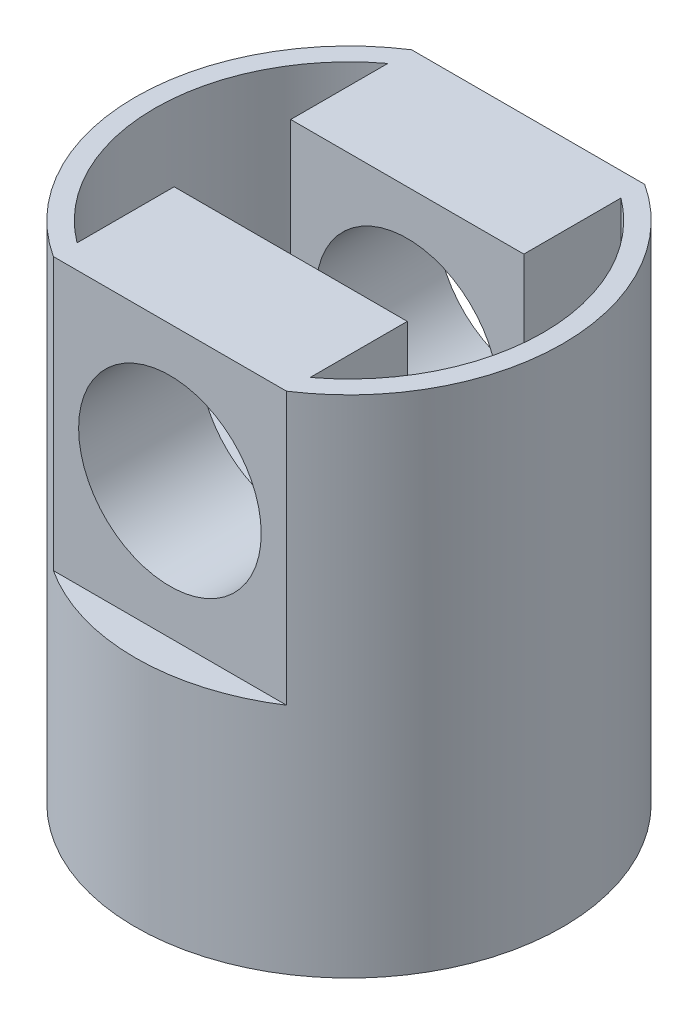
ISO-10303-21;
HEADER;
FILE_DESCRIPTION(('STEP AP214'),'2;1');
FILE_NAME('part.step','',(''),(''),'','','');
FILE_SCHEMA(('AUTOMOTIVE_DESIGN { 1 0 10303 214 1 1 1 1 }'));
ENDSEC;
DATA;
#1=APPLICATION_CONTEXT('core data for automotive mechanical design processes');
#2=APPLICATION_PROTOCOL_DEFINITION('international standard','automotive_design',2000,#1);
#3=PRODUCT_CONTEXT('',#1,'mechanical');
#4=PRODUCT('Part','Part','',(#3));
#5=PRODUCT_RELATED_PRODUCT_CATEGORY('part','',(#4));
#6=PRODUCT_DEFINITION_FORMATION('','',#4);
#7=PRODUCT_DEFINITION_CONTEXT('part definition',#1,'design');
#8=PRODUCT_DEFINITION('design','',#6,#7);
#9=PRODUCT_DEFINITION_SHAPE('','',#8);
#10=(LENGTH_UNIT() NAMED_UNIT(*) SI_UNIT(.MILLI.,.METRE.));
#11=(NAMED_UNIT(*) PLANE_ANGLE_UNIT() SI_UNIT($,.RADIAN.));
#12=(NAMED_UNIT(*) SI_UNIT($,.STERADIAN.) SOLID_ANGLE_UNIT());
#13=UNCERTAINTY_MEASURE_WITH_UNIT(LENGTH_MEASURE(1.E-05),#10,'distance_accuracy_value','');
#14=(GEOMETRIC_REPRESENTATION_CONTEXT(3) GLOBAL_UNCERTAINTY_ASSIGNED_CONTEXT((#13)) GLOBAL_UNIT_ASSIGNED_CONTEXT((#10,
#11,#12)) REPRESENTATION_CONTEXT('',''));
#15=CARTESIAN_POINT('',(0.,0.,0.));
#16=DIRECTION('',(0.,0.,1.));
#17=DIRECTION('',(1.,0.,0.));
#18=AXIS2_PLACEMENT_3D('',#15,#16,#17);
#19=CARTESIAN_POINT('',(-10.,2.,0.));
#20=DIRECTION('',(0.,-1.,0.));
#21=DIRECTION('',(0.,0.,-1.));
#22=AXIS2_PLACEMENT_3D('',#19,#20,#21);
#23=PLANE('',#22);
#24=CARTESIAN_POINT('',(0.,2.,0.));
#25=DIRECTION('',(0.,-1.,0.));
#26=DIRECTION('',(0.,0.,-1.));
#27=AXIS2_PLACEMENT_3D('',#24,#25,#26);
#28=CIRCLE('',#27,11.);
#29=CARTESIAN_POINT('',(6.,2.,9.21954445729288));
#30=VERTEX_POINT('',#29);
#31=CARTESIAN_POINT('',(-6.,1.99999999999999,9.21954445729289));
#32=VERTEX_POINT('',#31);
#33=EDGE_CURVE('E48',#30,#32,#28,.T.);
#34=ORIENTED_EDGE('',*,*,#33,.F.);
#35=DIRECTION('',(1.,0.,0.));
#36=VECTOR('',#35,1.);
#37=CARTESIAN_POINT('',(-6.,2.,9.21954445729289));
#38=LINE('',#37,#36);
#39=EDGE_CURVE('E55',#32,#30,#38,.T.);
#40=ORIENTED_EDGE('',*,*,#39,.F.);
#41=EDGE_LOOP('',(#34,#40));
#42=FACE_BOUND('',#41,.T.);
#43=ADVANCED_FACE('F39',(#42),#23,.F.);
#44=CARTESIAN_POINT('',(0.,2.,0.));
#45=DIRECTION('',(0.,-1.,0.));
#46=DIRECTION('',(0.,0.,-1.));
#47=AXIS2_PLACEMENT_3D('',#44,#45,#46);
#48=CIRCLE('',#47,11.);
#49=CARTESIAN_POINT('',(-6.,2.,-9.21954445729289));
#50=VERTEX_POINT('',#49);
#51=CARTESIAN_POINT('',(6.,2.,-9.21954445729289));
#52=VERTEX_POINT('',#51);
#53=EDGE_CURVE('E273',#50,#52,#48,.T.);
#54=ORIENTED_EDGE('',*,*,#53,.F.);
#55=DIRECTION('',(-1.,0.,0.));
#56=VECTOR('',#55,1.);
#57=CARTESIAN_POINT('',(-6.,2.,-9.21954445729289));
#58=LINE('',#57,#56);
#59=EDGE_CURVE('E208',#52,#50,#58,.T.);
#60=ORIENTED_EDGE('',*,*,#59,.F.);
#61=EDGE_LOOP('',(#54,#60));
#62=FACE_BOUND('',#61,.T.);
#63=ADVANCED_FACE('F289',(#62),#23,.F.);
#64=CARTESIAN_POINT('',(0.,0.,0.));
#65=DIRECTION('',(0.,-1.,0.));
#66=DIRECTION('',(0.,0.,-1.));
#67=AXIS2_PLACEMENT_3D('',#64,#65,#66);
#68=CYLINDRICAL_SURFACE('',#67,10.);
#69=CARTESIAN_POINT('',(0.,16.,0.));
#70=DIRECTION('',(0.,-1.,0.));
#71=DIRECTION('',(0.,0.,-1.));
#72=AXIS2_PLACEMENT_3D('',#69,#70,#71);
#73=CIRCLE('',#72,10.);
#74=CARTESIAN_POINT('',(-6.,16.,7.99999999999999));
#75=VERTEX_POINT('',#74);
#76=CARTESIAN_POINT('',(-6.,16.,-7.99999999999999));
#77=VERTEX_POINT('',#76);
#78=EDGE_CURVE('E258',#75,#77,#73,.T.);
#79=ORIENTED_EDGE('',*,*,#78,.F.);
#80=DIRECTION('',(0.,-1.,0.));
#81=VECTOR('',#80,1.);
#82=CARTESIAN_POINT('',(-6.,0.,8.));
#83=LINE('',#82,#81);
#84=CARTESIAN_POINT('',(-6.,2.,8.));
#85=VERTEX_POINT('',#84);
#86=EDGE_CURVE('E224',#75,#85,#83,.T.);
#87=ORIENTED_EDGE('',*,*,#86,.T.);
#88=CARTESIAN_POINT('',(0.,2.,0.));
#89=DIRECTION('',(0.,-1.,0.));
#90=DIRECTION('',(0.,0.,-1.));
#91=AXIS2_PLACEMENT_3D('',#88,#89,#90);
#92=CIRCLE('',#91,10.);
#93=CARTESIAN_POINT('',(-6.,2.,-7.99999999999999));
#94=VERTEX_POINT('',#93);
#95=EDGE_CURVE('E178',#85,#94,#92,.T.);
#96=ORIENTED_EDGE('',*,*,#95,.T.);
#97=DIRECTION('',(0.,-1.,0.));
#98=VECTOR('',#97,1.);
#99=CARTESIAN_POINT('',(-6.,0.,-8.));
#100=LINE('',#99,#98);
#101=EDGE_CURVE('E218',#94,#77,#100,.F.);
#102=ORIENTED_EDGE('',*,*,#101,.T.);
#103=EDGE_LOOP('',(#79,#87,#96,#102));
#104=FACE_BOUND('',#103,.T.);
#105=ADVANCED_FACE('F294',(#104),#68,.F.);
#106=CARTESIAN_POINT('',(-10.,0.,0.));
#107=DIRECTION('',(0.,1.,0.));
#108=DIRECTION('',(0.,0.,1.));
#109=AXIS2_PLACEMENT_3D('',#106,#107,#108);
#110=PLANE('',#109);
#111=DIRECTION('',(1.,0.,0.));
#112=VECTOR('',#111,1.);
#113=CARTESIAN_POINT('',(-11.5,0.,-2.));
#114=LINE('',#113,#112);
#115=CARTESIAN_POINT('',(-10.816653826392,0.,-2.));
#116=VERTEX_POINT('',#115);
#117=CARTESIAN_POINT('',(-9.79795897113271,0.,-2.));
#118=VERTEX_POINT('',#117);
#119=EDGE_CURVE('E233',#116,#118,#114,.T.);
#120=ORIENTED_EDGE('',*,*,#119,.T.);
#121=CARTESIAN_POINT('',(0.,0.,0.));
#122=DIRECTION('',(0.,-1.,0.));
#123=DIRECTION('',(0.,0.,-1.));
#124=AXIS2_PLACEMENT_3D('',#121,#122,#123);
#125=CIRCLE('',#124,10.);
#126=CARTESIAN_POINT('',(-9.79795897113271,0.,2.));
#127=VERTEX_POINT('',#126);
#128=EDGE_CURVE('E245',#118,#127,#125,.T.);
#129=ORIENTED_EDGE('',*,*,#128,.T.);
#130=DIRECTION('',(-1.,0.,0.));
#131=VECTOR('',#130,1.);
#132=CARTESIAN_POINT('',(-11.5,0.,2.));
#133=LINE('',#132,#131);
#134=CARTESIAN_POINT('',(-10.816653826392,0.,2.));
#135=VERTEX_POINT('',#134);
#136=EDGE_CURVE('E229',#127,#135,#133,.T.);
#137=ORIENTED_EDGE('',*,*,#136,.T.);
#138=CARTESIAN_POINT('',(0.,0.,0.));
#139=DIRECTION('',(0.,1.,0.));
#140=DIRECTION('',(0.,0.,1.));
#141=AXIS2_PLACEMENT_3D('',#138,#139,#140);
#142=CIRCLE('',#141,11.);
#143=EDGE_CURVE('E242',#116,#135,#142,.T.);
#144=ORIENTED_EDGE('',*,*,#143,.F.);
#145=EDGE_LOOP('',(#120,#129,#137,#144));
#146=FACE_BOUND('',#145,.T.);
#147=ADVANCED_FACE('F41',(#146),#110,.F.);
#148=ORIENTED_EDGE('',*,*,#95,.F.);
#149=DIRECTION('',(0.,0.,1.));
#150=VECTOR('',#149,1.);
#151=CARTESIAN_POINT('',(-6.,2.,3.));
#152=LINE('',#151,#150);
#153=CARTESIAN_POINT('',(-6.,2.,3.));
#154=VERTEX_POINT('',#153);
#155=EDGE_CURVE('E167',#154,#85,#152,.T.);
#156=ORIENTED_EDGE('',*,*,#155,.F.);
#157=DIRECTION('',(-1.,0.,0.));
#158=VECTOR('',#157,1.);
#159=CARTESIAN_POINT('',(6.,2.,3.));
#160=LINE('',#159,#158);
#161=CARTESIAN_POINT('',(6.,2.,3.));
#162=VERTEX_POINT('',#161);
#163=EDGE_CURVE('E153',#162,#154,#160,.T.);
#164=ORIENTED_EDGE('',*,*,#163,.F.);
#165=DIRECTION('',(0.,0.,-1.));
#166=VECTOR('',#165,1.);
#167=CARTESIAN_POINT('',(6.,2.,9.21954445729289));
#168=LINE('',#167,#166);
#169=CARTESIAN_POINT('',(6.,2.,8.));
#170=VERTEX_POINT('',#169);
#171=EDGE_CURVE('E183',#170,#162,#168,.T.);
#172=ORIENTED_EDGE('',*,*,#171,.F.);
#173=CARTESIAN_POINT('',(6.,2.,-7.99999999999999));
#174=VERTEX_POINT('',#173);
#175=EDGE_CURVE('E262',#174,#170,#92,.T.);
#176=ORIENTED_EDGE('',*,*,#175,.F.);
#177=DIRECTION('',(0.,0.,-1.));
#178=VECTOR('',#177,1.);
#179=CARTESIAN_POINT('',(6.,2.,-9.21954445729289));
#180=LINE('',#179,#178);
#181=CARTESIAN_POINT('',(6.,1.99999999999999,-3.));
#182=VERTEX_POINT('',#181);
#183=EDGE_CURVE('E210',#182,#174,#180,.T.);
#184=ORIENTED_EDGE('',*,*,#183,.F.);
#185=DIRECTION('',(1.,0.,0.));
#186=VECTOR('',#185,1.);
#187=CARTESIAN_POINT('',(6.,2.,-3.));
#188=LINE('',#187,#186);
#189=CARTESIAN_POINT('',(-6.,2.,-3.));
#190=VERTEX_POINT('',#189);
#191=EDGE_CURVE('E194',#190,#182,#188,.T.);
#192=ORIENTED_EDGE('',*,*,#191,.F.);
#193=DIRECTION('',(0.,0.,1.));
#194=VECTOR('',#193,1.);
#195=CARTESIAN_POINT('',(-6.,2.,-3.));
#196=LINE('',#195,#194);
#197=EDGE_CURVE('E205',#94,#190,#196,.T.);
#198=ORIENTED_EDGE('',*,*,#197,.F.);
#199=EDGE_LOOP('',(#148,#156,#164,#172,#176,#184,#192,#198));
#200=FACE_BOUND('',#199,.T.);
#201=ADVANCED_FACE('F175',(#200),#23,.F.);
#202=ORIENTED_EDGE('',*,*,#175,.T.);
#203=DIRECTION('',(0.,-1.,0.));
#204=VECTOR('',#203,1.);
#205=CARTESIAN_POINT('',(6.,0.,8.));
#206=LINE('',#205,#204);
#207=CARTESIAN_POINT('',(6.,16.,8.));
#208=VERTEX_POINT('',#207);
#209=EDGE_CURVE('E221',#170,#208,#206,.F.);
#210=ORIENTED_EDGE('',*,*,#209,.T.);
#211=CARTESIAN_POINT('',(6.,16.,-7.99999999999999));
#212=VERTEX_POINT('',#211);
#213=EDGE_CURVE('E259',#212,#208,#73,.T.);
#214=ORIENTED_EDGE('',*,*,#213,.F.);
#215=DIRECTION('',(0.,-1.,0.));
#216=VECTOR('',#215,1.);
#217=CARTESIAN_POINT('',(6.,0.,-8.));
#218=LINE('',#217,#216);
#219=EDGE_CURVE('E215',#212,#174,#218,.T.);
#220=ORIENTED_EDGE('',*,*,#219,.T.);
#221=EDGE_LOOP('',(#202,#210,#214,#220));
#222=FACE_BOUND('',#221,.T.);
#223=ADVANCED_FACE('F298',(#222),#68,.F.);
#224=CARTESIAN_POINT('',(-10.,16.,0.));
#225=DIRECTION('',(0.,-1.,0.));
#226=DIRECTION('',(0.,0.,-1.));
#227=AXIS2_PLACEMENT_3D('',#224,#225,#226);
#228=PLANE('',#227);
#229=CARTESIAN_POINT('',(0.,16.,0.));
#230=DIRECTION('',(0.,-1.,0.));
#231=DIRECTION('',(0.,0.,-1.));
#232=AXIS2_PLACEMENT_3D('',#229,#230,#231);
#233=CIRCLE('',#232,11.);
#234=CARTESIAN_POINT('',(-6.,16.,9.21954445729289));
#235=VERTEX_POINT('',#234);
#236=CARTESIAN_POINT('',(-6.,16.,-9.21954445729289));
#237=VERTEX_POINT('',#236);
#238=EDGE_CURVE('E254',#235,#237,#233,.T.);
#239=ORIENTED_EDGE('',*,*,#238,.F.);
#240=DIRECTION('',(1.,0.,0.));
#241=VECTOR('',#240,1.);
#242=CARTESIAN_POINT('',(-6.,16.,9.21954445729289));
#243=LINE('',#242,#241);
#244=CARTESIAN_POINT('',(6.,16.,9.21954445729289));
#245=VERTEX_POINT('',#244);
#246=EDGE_CURVE('E181',#235,#245,#243,.T.);
#247=ORIENTED_EDGE('',*,*,#246,.T.);
#248=CARTESIAN_POINT('',(6.,16.,-9.21954445729288));
#249=VERTEX_POINT('',#248);
#250=EDGE_CURVE('E255',#249,#245,#233,.T.);
#251=ORIENTED_EDGE('',*,*,#250,.F.);
#252=DIRECTION('',(-1.,0.,0.));
#253=VECTOR('',#252,1.);
#254=CARTESIAN_POINT('',(-6.,16.,-9.21954445729289));
#255=LINE('',#254,#253);
#256=EDGE_CURVE('E63',#249,#237,#255,.T.);
#257=ORIENTED_EDGE('',*,*,#256,.T.);
#258=EDGE_LOOP('',(#239,#247,#251,#257));
#259=FACE_BOUND('',#258,.T.);
#260=ORIENTED_EDGE('',*,*,#213,.T.);
#261=DIRECTION('',(0.,0.,-1.));
#262=VECTOR('',#261,1.);
#263=CARTESIAN_POINT('',(6.,16.,9.21954445729289));
#264=LINE('',#263,#262);
#265=CARTESIAN_POINT('',(6.,16.,3.));
#266=VERTEX_POINT('',#265);
#267=EDGE_CURVE('E179',#208,#266,#264,.T.);
#268=ORIENTED_EDGE('',*,*,#267,.T.);
#269=DIRECTION('',(-1.,0.,0.));
#270=VECTOR('',#269,1.);
#271=CARTESIAN_POINT('',(6.,16.,3.));
#272=LINE('',#271,#270);
#273=CARTESIAN_POINT('',(-6.,16.,3.));
#274=VERTEX_POINT('',#273);
#275=EDGE_CURVE('E187',#266,#274,#272,.T.);
#276=ORIENTED_EDGE('',*,*,#275,.T.);
#277=DIRECTION('',(0.,0.,1.));
#278=VECTOR('',#277,1.);
#279=CARTESIAN_POINT('',(-6.,16.,3.));
#280=LINE('',#279,#278);
#281=EDGE_CURVE('E170',#274,#75,#280,.T.);
#282=ORIENTED_EDGE('',*,*,#281,.T.);
#283=ORIENTED_EDGE('',*,*,#78,.T.);
#284=DIRECTION('',(0.,0.,1.));
#285=VECTOR('',#284,1.);
#286=CARTESIAN_POINT('',(-6.,16.,-3.));
#287=LINE('',#286,#285);
#288=CARTESIAN_POINT('',(-6.,16.,-3.));
#289=VERTEX_POINT('',#288);
#290=EDGE_CURVE('E189',#77,#289,#287,.T.);
#291=ORIENTED_EDGE('',*,*,#290,.T.);
#292=DIRECTION('',(1.,0.,0.));
#293=VECTOR('',#292,1.);
#294=CARTESIAN_POINT('',(6.,16.,-3.));
#295=LINE('',#294,#293);
#296=CARTESIAN_POINT('',(6.,16.,-3.));
#297=VERTEX_POINT('',#296);
#298=EDGE_CURVE('E198',#289,#297,#295,.T.);
#299=ORIENTED_EDGE('',*,*,#298,.T.);
#300=DIRECTION('',(0.,0.,-1.));
#301=VECTOR('',#300,1.);
#302=CARTESIAN_POINT('',(6.,16.,-9.21954445729289));
#303=LINE('',#302,#301);
#304=EDGE_CURVE('E195',#297,#212,#303,.T.);
#305=ORIENTED_EDGE('',*,*,#304,.T.);
#306=EDGE_LOOP('',(#260,#268,#276,#282,#283,#291,#299,#305));
#307=FACE_BOUND('',#306,.T.);
#308=ADVANCED_FACE('F303',(#259,#307),#228,.F.);
#309=CARTESIAN_POINT('',(0.,0.,0.));
#310=DIRECTION('',(0.,-1.,0.));
#311=DIRECTION('',(0.,0.,-1.));
#312=AXIS2_PLACEMENT_3D('',#309,#310,#311);
#313=CYLINDRICAL_SURFACE('',#312,11.);
#314=ORIENTED_EDGE('',*,*,#143,.T.);
#315=DIRECTION('',(0.,-1.,0.));
#316=VECTOR('',#315,1.);
#317=CARTESIAN_POINT('',(-10.816653826392,0.,2.));
#318=LINE('',#317,#316);
#319=CARTESIAN_POINT('',(-10.816653826392,-10.,2.));
#320=VERTEX_POINT('',#319);
#321=EDGE_CURVE('E239',#135,#320,#318,.T.);
#322=ORIENTED_EDGE('',*,*,#321,.T.);
#323=CARTESIAN_POINT('',(0.,-10.,0.));
#324=DIRECTION('',(0.,-1.,0.));
#325=DIRECTION('',(0.,0.,-1.));
#326=AXIS2_PLACEMENT_3D('',#323,#324,#325);
#327=CIRCLE('',#326,11.);
#328=CARTESIAN_POINT('',(-10.816653826392,-10.,-2.));
#329=VERTEX_POINT('',#328);
#330=EDGE_CURVE('E251',#329,#320,#327,.T.);
#331=ORIENTED_EDGE('',*,*,#330,.F.);
#332=DIRECTION('',(0.,-1.,0.));
#333=VECTOR('',#332,1.);
#334=CARTESIAN_POINT('',(-10.816653826392,0.,-2.));
#335=LINE('',#334,#333);
#336=EDGE_CURVE('E236',#329,#116,#335,.F.);
#337=ORIENTED_EDGE('',*,*,#336,.T.);
#338=EDGE_LOOP('',(#314,#322,#331,#337));
#339=FACE_BOUND('',#338,.T.);
#340=ORIENTED_EDGE('',*,*,#33,.T.);
#341=DIRECTION('',(0.,-1.,0.));
#342=VECTOR('',#341,1.);
#343=CARTESIAN_POINT('',(-6.,0.,9.21954445729288));
#344=LINE('',#343,#342);
#345=EDGE_CURVE('E11',#32,#235,#344,.F.);
#346=ORIENTED_EDGE('',*,*,#345,.T.);
#347=ORIENTED_EDGE('',*,*,#238,.T.);
#348=DIRECTION('',(0.,-1.,0.));
#349=VECTOR('',#348,1.);
#350=CARTESIAN_POINT('',(-6.,0.,-9.21954445729288));
#351=LINE('',#350,#349);
#352=EDGE_CURVE('E276',#237,#50,#351,.T.);
#353=ORIENTED_EDGE('',*,*,#352,.T.);
#354=ORIENTED_EDGE('',*,*,#53,.T.);
#355=DIRECTION('',(0.,-1.,0.));
#356=VECTOR('',#355,1.);
#357=CARTESIAN_POINT('',(6.,0.,-9.21954445729288));
#358=LINE('',#357,#356);
#359=EDGE_CURVE('E271',#52,#249,#358,.F.);
#360=ORIENTED_EDGE('',*,*,#359,.T.);
#361=ORIENTED_EDGE('',*,*,#250,.T.);
#362=DIRECTION('',(0.,-1.,0.));
#363=VECTOR('',#362,1.);
#364=CARTESIAN_POINT('',(6.,0.,9.21954445729288));
#365=LINE('',#364,#363);
#366=EDGE_CURVE('E279',#245,#30,#365,.T.);
#367=ORIENTED_EDGE('',*,*,#366,.T.);
#368=EDGE_LOOP('',(#340,#346,#347,#353,#354,#360,#361,#367));
#369=FACE_BOUND('',#368,.T.);
#370=ADVANCED_FACE('F284',(#339,#369),#313,.T.);
#371=CARTESIAN_POINT('',(-11.,-10.,0.));
#372=DIRECTION('',(0.,1.,0.));
#373=DIRECTION('',(0.,0.,1.));
#374=AXIS2_PLACEMENT_3D('',#371,#372,#373);
#375=PLANE('',#374);
#376=ORIENTED_EDGE('',*,*,#330,.T.);
#377=DIRECTION('',(-1.,0.,0.));
#378=VECTOR('',#377,1.);
#379=CARTESIAN_POINT('',(-11.5,-10.,2.));
#380=LINE('',#379,#378);
#381=CARTESIAN_POINT('',(-9.79795897113271,-10.,2.));
#382=VERTEX_POINT('',#381);
#383=EDGE_CURVE('E226',#382,#320,#380,.T.);
#384=ORIENTED_EDGE('',*,*,#383,.F.);
#385=CARTESIAN_POINT('',(0.,-10.,0.));
#386=DIRECTION('',(0.,-1.,0.));
#387=DIRECTION('',(0.,0.,-1.));
#388=AXIS2_PLACEMENT_3D('',#385,#386,#387);
#389=CIRCLE('',#388,10.);
#390=CARTESIAN_POINT('',(-9.79795897113271,-10.,-2.));
#391=VERTEX_POINT('',#390);
#392=EDGE_CURVE('E248',#391,#382,#389,.T.);
#393=ORIENTED_EDGE('',*,*,#392,.F.);
#394=DIRECTION('',(1.,0.,0.));
#395=VECTOR('',#394,1.);
#396=CARTESIAN_POINT('',(-11.5,-10.,-2.));
#397=LINE('',#396,#395);
#398=EDGE_CURVE('E227',#329,#391,#397,.T.);
#399=ORIENTED_EDGE('',*,*,#398,.F.);
#400=EDGE_LOOP('',(#376,#384,#393,#399));
#401=FACE_BOUND('',#400,.T.);
#402=ADVANCED_FACE('F321',(#401),#375,.F.);
#403=CARTESIAN_POINT('',(0.,0.,0.));
#404=DIRECTION('',(0.,-1.,0.));
#405=DIRECTION('',(0.,0.,-1.));
#406=AXIS2_PLACEMENT_3D('',#403,#404,#405);
#407=CYLINDRICAL_SURFACE('',#406,10.);
#408=ORIENTED_EDGE('',*,*,#392,.T.);
#409=DIRECTION('',(0.,-1.,0.));
#410=VECTOR('',#409,1.);
#411=CARTESIAN_POINT('',(-9.79795897113271,0.,2.));
#412=LINE('',#411,#410);
#413=EDGE_CURVE('E268',#382,#127,#412,.F.);
#414=ORIENTED_EDGE('',*,*,#413,.T.);
#415=ORIENTED_EDGE('',*,*,#128,.F.);
#416=DIRECTION('',(0.,-1.,0.));
#417=VECTOR('',#416,1.);
#418=CARTESIAN_POINT('',(-9.79795897113271,0.,-2.));
#419=LINE('',#418,#417);
#420=EDGE_CURVE('E265',#118,#391,#419,.T.);
#421=ORIENTED_EDGE('',*,*,#420,.T.);
#422=EDGE_LOOP('',(#408,#414,#415,#421));
#423=FACE_BOUND('',#422,.T.);
#424=ADVANCED_FACE('F315',(#423),#407,.F.);
#425=CARTESIAN_POINT('',(-11.5,5.,2.));
#426=DIRECTION('',(0.,0.,1.));
#427=DIRECTION('',(1.,0.,0.));
#428=AXIS2_PLACEMENT_3D('',#425,#426,#427);
#429=PLANE('',#428);
#430=ORIENTED_EDGE('',*,*,#136,.F.);
#431=ORIENTED_EDGE('',*,*,#413,.F.);
#432=ORIENTED_EDGE('',*,*,#383,.T.);
#433=ORIENTED_EDGE('',*,*,#321,.F.);
#434=EDGE_LOOP('',(#430,#431,#432,#433));
#435=FACE_BOUND('',#434,.T.);
#436=ADVANCED_FACE('F319',(#435),#429,.F.);
#437=CARTESIAN_POINT('',(-11.5,5.,-2.));
#438=DIRECTION('',(0.,0.,-1.));
#439=DIRECTION('',(-1.,0.,0.));
#440=AXIS2_PLACEMENT_3D('',#437,#438,#439);
#441=PLANE('',#440);
#442=ORIENTED_EDGE('',*,*,#398,.T.);
#443=ORIENTED_EDGE('',*,*,#420,.F.);
#444=ORIENTED_EDGE('',*,*,#119,.F.);
#445=ORIENTED_EDGE('',*,*,#336,.F.);
#446=EDGE_LOOP('',(#442,#443,#444,#445));
#447=FACE_BOUND('',#446,.T.);
#448=ADVANCED_FACE('F325',(#447),#441,.F.);
#449=CARTESIAN_POINT('',(6.,-11.5160176552209,-9.21954445729289));
#450=DIRECTION('',(1.,0.,0.));
#451=DIRECTION('',(0.,0.,-1.));
#452=AXIS2_PLACEMENT_3D('',#449,#450,#451);
#453=PLANE('',#452);
#454=ORIENTED_EDGE('',*,*,#219,.F.);
#455=ORIENTED_EDGE('',*,*,#304,.F.);
#456=DIRECTION('',(0.,1.,0.));
#457=VECTOR('',#456,1.);
#458=CARTESIAN_POINT('',(6.,-11.5160176552209,-3.));
#459=LINE('',#458,#457);
#460=EDGE_CURVE('E204',#182,#297,#459,.T.);
#461=ORIENTED_EDGE('',*,*,#460,.F.);
#462=ORIENTED_EDGE('',*,*,#183,.T.);
#463=EDGE_LOOP('',(#454,#455,#461,#462));
#464=FACE_BOUND('',#463,.T.);
#465=ADVANCED_FACE('F326',(#464),#453,.T.);
#466=CARTESIAN_POINT('',(-6.,-11.5160176552209,-3.));
#467=DIRECTION('',(-1.,0.,0.));
#468=DIRECTION('',(0.,0.,1.));
#469=AXIS2_PLACEMENT_3D('',#466,#467,#468);
#470=PLANE('',#469);
#471=ORIENTED_EDGE('',*,*,#101,.F.);
#472=ORIENTED_EDGE('',*,*,#197,.T.);
#473=DIRECTION('',(0.,1.,0.));
#474=VECTOR('',#473,1.);
#475=CARTESIAN_POINT('',(-6.,-11.5160176552209,-3.));
#476=LINE('',#475,#474);
#477=EDGE_CURVE('E207',#190,#289,#476,.T.);
#478=ORIENTED_EDGE('',*,*,#477,.T.);
#479=ORIENTED_EDGE('',*,*,#290,.F.);
#480=EDGE_LOOP('',(#471,#472,#478,#479));
#481=FACE_BOUND('',#480,.T.);
#482=ADVANCED_FACE('F332',(#481),#470,.T.);
#483=CARTESIAN_POINT('',(6.,-11.5160176552209,-3.));
#484=DIRECTION('',(0.,0.,1.));
#485=DIRECTION('',(1.,0.,0.));
#486=AXIS2_PLACEMENT_3D('',#483,#484,#485);
#487=PLANE('',#486);
#488=CARTESIAN_POINT('',(0.,9.,-3.));
#489=DIRECTION('',(0.,0.,1.));
#490=DIRECTION('',(1.,0.,0.));
#491=AXIS2_PLACEMENT_3D('',#488,#489,#490);
#492=CIRCLE('',#491,4.7);
#493=CARTESIAN_POINT('',(4.7,9.,-3.));
#494=VERTEX_POINT('',#493);
#495=EDGE_CURVE('E172',#494,#494,#492,.T.);
#496=ORIENTED_EDGE('',*,*,#495,.F.);
#497=EDGE_LOOP('',(#496));
#498=FACE_BOUND('',#497,.T.);
#499=ORIENTED_EDGE('',*,*,#477,.F.);
#500=ORIENTED_EDGE('',*,*,#191,.T.);
#501=ORIENTED_EDGE('',*,*,#460,.T.);
#502=ORIENTED_EDGE('',*,*,#298,.F.);
#503=EDGE_LOOP('',(#499,#500,#501,#502));
#504=FACE_BOUND('',#503,.T.);
#505=ADVANCED_FACE('F337',(#498,#504),#487,.T.);
#506=CARTESIAN_POINT('',(-6.,-11.5160176552209,-9.21954445729289));
#507=DIRECTION('',(0.,0.,-1.));
#508=DIRECTION('',(-1.,0.,0.));
#509=AXIS2_PLACEMENT_3D('',#506,#507,#508);
#510=PLANE('',#509);
#511=CARTESIAN_POINT('',(0.,9.,-9.21954445729289));
#512=DIRECTION('',(0.,0.,-1.));
#513=DIRECTION('',(-1.,0.,0.));
#514=AXIS2_PLACEMENT_3D('',#511,#512,#513);
#515=CIRCLE('',#514,4.7);
#516=CARTESIAN_POINT('',(4.7,9.,-9.21954445729288));
#517=VERTEX_POINT('',#516);
#518=EDGE_CURVE('E359',#517,#517,#515,.F.);
#519=ORIENTED_EDGE('',*,*,#518,.T.);
#520=EDGE_LOOP('',(#519));
#521=FACE_BOUND('',#520,.T.);
#522=ORIENTED_EDGE('',*,*,#359,.F.);
#523=ORIENTED_EDGE('',*,*,#59,.T.);
#524=ORIENTED_EDGE('',*,*,#352,.F.);
#525=ORIENTED_EDGE('',*,*,#256,.F.);
#526=EDGE_LOOP('',(#522,#523,#524,#525));
#527=FACE_BOUND('',#526,.T.);
#528=ADVANCED_FACE('F374',(#521,#527),#510,.T.);
#529=CARTESIAN_POINT('',(-6.,-11.5160176552209,3.));
#530=DIRECTION('',(-1.,0.,0.));
#531=DIRECTION('',(0.,0.,1.));
#532=AXIS2_PLACEMENT_3D('',#529,#530,#531);
#533=PLANE('',#532);
#534=ORIENTED_EDGE('',*,*,#86,.F.);
#535=ORIENTED_EDGE('',*,*,#281,.F.);
#536=DIRECTION('',(0.,1.,0.));
#537=VECTOR('',#536,1.);
#538=CARTESIAN_POINT('',(-6.,-11.5160176552209,3.));
#539=LINE('',#538,#537);
#540=EDGE_CURVE('E157',#154,#274,#539,.T.);
#541=ORIENTED_EDGE('',*,*,#540,.F.);
#542=ORIENTED_EDGE('',*,*,#155,.T.);
#543=EDGE_LOOP('',(#534,#535,#541,#542));
#544=FACE_BOUND('',#543,.T.);
#545=ADVANCED_FACE('F166',(#544),#533,.T.);
#546=CARTESIAN_POINT('',(6.,-11.5160176552209,9.21954445729289));
#547=DIRECTION('',(1.,0.,0.));
#548=DIRECTION('',(0.,0.,-1.));
#549=AXIS2_PLACEMENT_3D('',#546,#547,#548);
#550=PLANE('',#549);
#551=ORIENTED_EDGE('',*,*,#209,.F.);
#552=ORIENTED_EDGE('',*,*,#171,.T.);
#553=DIRECTION('',(0.,1.,0.));
#554=VECTOR('',#553,1.);
#555=CARTESIAN_POINT('',(6.,-11.5160176552209,3.));
#556=LINE('',#555,#554);
#557=EDGE_CURVE('E160',#162,#266,#556,.T.);
#558=ORIENTED_EDGE('',*,*,#557,.T.);
#559=ORIENTED_EDGE('',*,*,#267,.F.);
#560=EDGE_LOOP('',(#551,#552,#558,#559));
#561=FACE_BOUND('',#560,.T.);
#562=ADVANCED_FACE('F353',(#561),#550,.T.);
#563=CARTESIAN_POINT('',(-6.,-11.5160176552209,9.21954445729289));
#564=DIRECTION('',(0.,0.,1.));
#565=DIRECTION('',(1.,0.,0.));
#566=AXIS2_PLACEMENT_3D('',#563,#564,#565);
#567=PLANE('',#566);
#568=CARTESIAN_POINT('',(0.,9.,9.21954445729289));
#569=DIRECTION('',(0.,0.,1.));
#570=DIRECTION('',(1.,0.,0.));
#571=AXIS2_PLACEMENT_3D('',#568,#569,#570);
#572=CIRCLE('',#571,4.7);
#573=CARTESIAN_POINT('',(4.7,9.,9.21954445729289));
#574=VERTEX_POINT('',#573);
#575=EDGE_CURVE('E362',#574,#574,#572,.T.);
#576=ORIENTED_EDGE('',*,*,#575,.F.);
#577=EDGE_LOOP('',(#576));
#578=FACE_BOUND('',#577,.T.);
#579=ORIENTED_EDGE('',*,*,#345,.F.);
#580=ORIENTED_EDGE('',*,*,#39,.T.);
#581=ORIENTED_EDGE('',*,*,#366,.F.);
#582=ORIENTED_EDGE('',*,*,#246,.F.);
#583=EDGE_LOOP('',(#579,#580,#581,#582));
#584=FACE_BOUND('',#583,.T.);
#585=ADVANCED_FACE('F368',(#578,#584),#567,.T.);
#586=CARTESIAN_POINT('',(6.,-11.5160176552209,3.));
#587=DIRECTION('',(0.,0.,-1.));
#588=DIRECTION('',(-1.,0.,0.));
#589=AXIS2_PLACEMENT_3D('',#586,#587,#588);
#590=PLANE('',#589);
#591=CARTESIAN_POINT('',(0.,9.,3.));
#592=DIRECTION('',(0.,0.,-1.));
#593=DIRECTION('',(-1.,0.,0.));
#594=AXIS2_PLACEMENT_3D('',#591,#592,#593);
#595=CIRCLE('',#594,4.7);
#596=CARTESIAN_POINT('',(-4.7,9.,3.));
#597=VERTEX_POINT('',#596);
#598=EDGE_CURVE('E43',#597,#597,#595,.T.);
#599=ORIENTED_EDGE('',*,*,#598,.F.);
#600=EDGE_LOOP('',(#599));
#601=FACE_BOUND('',#600,.T.);
#602=ORIENTED_EDGE('',*,*,#557,.F.);
#603=ORIENTED_EDGE('',*,*,#163,.T.);
#604=ORIENTED_EDGE('',*,*,#540,.T.);
#605=ORIENTED_EDGE('',*,*,#275,.F.);
#606=EDGE_LOOP('',(#602,#603,#604,#605));
#607=FACE_BOUND('',#606,.T.);
#608=ADVANCED_FACE('F155',(#601,#607),#590,.T.);
#609=CARTESIAN_POINT('',(0.,9.,-22.5131519436));
#610=DIRECTION('',(0.,0.,1.));
#611=DIRECTION('',(1.,0.,0.));
#612=AXIS2_PLACEMENT_3D('',#609,#610,#611);
#613=CYLINDRICAL_SURFACE('',#612,4.7);
#614=ORIENTED_EDGE('',*,*,#598,.T.);
#615=EDGE_LOOP('',(#614));
#616=FACE_BOUND('',#615,.T.);
#617=ORIENTED_EDGE('',*,*,#575,.T.);
#618=EDGE_LOOP('',(#617));
#619=FACE_BOUND('',#618,.T.);
#620=ADVANCED_FACE('F366',(#616,#619),#613,.F.);
#621=CARTESIAN_POINT('',(4.7,9.,-3.));
#622=CARTESIAN_POINT('',(4.7,9.,-3.06478692143014));
#623=CARTESIAN_POINT('',(4.7,9.,-3.12957384286027));
#624=CARTESIAN_POINT('',(4.7,9.,-3.25914768572054));
#625=CARTESIAN_POINT('',(4.7,9.,-3.32393460715067));
#626=CARTESIAN_POINT('',(4.7,9.,-3.45350845001094));
#627=CARTESIAN_POINT('',(4.7,9.,-3.51829537144108));
#628=CARTESIAN_POINT('',(4.7,9.,-3.64786921430135));
#629=CARTESIAN_POINT('',(4.7,9.,-3.71265613573148));
#630=CARTESIAN_POINT('',(4.7,9.,-3.84222997859175));
#631=CARTESIAN_POINT('',(4.7,9.,-3.90701690002188));
#632=CARTESIAN_POINT('',(4.7,9.,-4.03659074288215));
#633=CARTESIAN_POINT('',(4.7,9.,-4.10137766431228));
#634=CARTESIAN_POINT('',(4.7,9.,-4.23095150717255));
#635=CARTESIAN_POINT('',(4.7,9.,-4.29573842860268));
#636=CARTESIAN_POINT('',(4.7,9.,-4.42531227146295));
#637=CARTESIAN_POINT('',(4.7,9.,-4.49009919289309));
#638=CARTESIAN_POINT('',(4.7,9.,-4.61967303575336));
#639=CARTESIAN_POINT('',(4.7,9.,-4.68445995718349));
#640=CARTESIAN_POINT('',(4.7,9.,-4.81403380004376));
#641=CARTESIAN_POINT('',(4.7,9.,-4.87882072147389));
#642=CARTESIAN_POINT('',(4.7,9.,-5.00839456433416));
#643=CARTESIAN_POINT('',(4.7,9.,-5.0731814857643));
#644=CARTESIAN_POINT('',(4.7,9.,-5.20275532862456));
#645=CARTESIAN_POINT('',(4.7,9.,-5.2675422500547));
#646=CARTESIAN_POINT('',(4.7,9.,-5.39711609291497));
#647=CARTESIAN_POINT('',(4.7,9.,-5.4619030143451));
#648=CARTESIAN_POINT('',(4.7,9.,-5.59147685720537));
#649=CARTESIAN_POINT('',(4.7,9.,-5.6562637786355));
#650=CARTESIAN_POINT('',(4.7,9.,-5.78583762149577));
#651=CARTESIAN_POINT('',(4.7,9.,-5.85062454292591));
#652=CARTESIAN_POINT('',(4.7,9.,-5.98019838578618));
#653=CARTESIAN_POINT('',(4.7,9.,-6.04498530721631));
#654=CARTESIAN_POINT('',(4.7,9.,-6.17455915007658));
#655=CARTESIAN_POINT('',(4.7,9.,-6.23934607150671));
#656=CARTESIAN_POINT('',(4.7,9.,-6.36891991436698));
#657=CARTESIAN_POINT('',(4.7,9.,-6.43370683579711));
#658=CARTESIAN_POINT('',(4.7,9.,-6.56328067865738));
#659=CARTESIAN_POINT('',(4.7,9.,-6.62806760008752));
#660=CARTESIAN_POINT('',(4.7,9.,-6.75764144294778));
#661=CARTESIAN_POINT('',(4.7,9.,-6.82242836437792));
#662=CARTESIAN_POINT('',(4.7,9.,-6.95200220723819));
#663=CARTESIAN_POINT('',(4.7,9.,-7.01678912866832));
#664=CARTESIAN_POINT('',(4.7,9.,-7.14636297152859));
#665=CARTESIAN_POINT('',(4.7,9.,-7.21114989295872));
#666=CARTESIAN_POINT('',(4.7,9.,-7.34072373581899));
#667=CARTESIAN_POINT('',(4.7,9.,-7.40551065724913));
#668=CARTESIAN_POINT('',(4.7,9.,-7.5350845001094));
#669=CARTESIAN_POINT('',(4.7,9.,-7.59987142153953));
#670=CARTESIAN_POINT('',(4.7,9.,-7.7294452643998));
#671=CARTESIAN_POINT('',(4.7,9.,-7.79423218582993));
#672=CARTESIAN_POINT('',(4.7,9.,-7.9238060286902));
#673=CARTESIAN_POINT('',(4.7,9.,-7.98859295012033));
#674=CARTESIAN_POINT('',(4.7,9.,-8.1181667929806));
#675=CARTESIAN_POINT('',(4.7,9.,-8.18295371441074));
#676=CARTESIAN_POINT('',(4.7,9.,-8.31252755727101));
#677=CARTESIAN_POINT('',(4.7,9.,-8.37731447870114));
#678=CARTESIAN_POINT('',(4.7,9.,-8.50688832156141));
#679=CARTESIAN_POINT('',(4.7,9.,-8.57167524299154));
#680=CARTESIAN_POINT('',(4.7,9.,-8.70124908585181));
#681=CARTESIAN_POINT('',(4.7,9.,-8.76603600728194));
#682=CARTESIAN_POINT('',(4.7,9.,-8.89560985014221));
#683=CARTESIAN_POINT('',(4.7,9.,-8.96039677157235));
#684=CARTESIAN_POINT('',(4.7,9.,-9.08997061443262));
#685=CARTESIAN_POINT('',(4.7,9.,-9.15475753586275));
#686=CARTESIAN_POINT('',(4.7,9.,-9.21954445729288));
#687=B_SPLINE_CURVE_WITH_KNOTS('',3,(#621,#622,#623,#624,#625,#626,#627,#628,#629,#630,#631,
#632,#633,#634,#635,#636,#637,#638,#639,#640,#641,#642,#643,#644,#645,#646,#647,#648,#649,#650,
#651,#652,#653,#654,#655,#656,#657,#658,#659,#660,#661,#662,#663,#664,#665,#666,#667,#668,#669,
#670,#671,#672,#673,#674,#675,#676,#677,#678,#679,#680,#681,#682,#683,#684,#685,#686),
.UNSPECIFIED.,.F.,.F.,(4,2,2,2,2,2,2,2,2,2,2,2,2,2,2,2,2,2,2,2,2,2,2,2,2,2,2,2,2,2,2,2,4),(0.,
0.194360764290403,0.388721528580806,0.583082292871209,0.777443057161611,0.971803821452014,
1.16616458574241,1.36052535003282,1.55488611432322,1.74924687861362,1.94360764290403,
2.13796840719443,2.33232917148483,2.52668993577523,2.72105070006564,2.91541146435604,
3.10977222864644,3.30413299293684,3.49849375722724,3.69285452151765,3.88721528580805,
4.08157605009845,4.27593681438886,4.47029757867926,4.66465834296966,4.85901910726006,
5.05337987155047,5.24774063584087,5.44210140013127,5.63646216442167,5.83082292871208,
6.02518369300248,6.21954445729288),.UNSPECIFIED.);
#688=EDGE_CURVE('BSEAM394',#494,#517,#687,.T.);
#689=ORIENTED_EDGE('',*,*,#495,.T.);
#690=ORIENTED_EDGE('',*,*,#518,.F.);
#691=ORIENTED_EDGE('',*,*,#688,.T.);
#692=ORIENTED_EDGE('',*,*,#688,.F.);
#693=EDGE_LOOP('',(#689,#691,#690,#692));
#694=FACE_BOUND('',#693,.T.);
#695=ADVANCED_FACE('F394',(#694),#613,.F.);
#696=CLOSED_SHELL('',(#43,#63,#105,#147,#201,#223,#308,#370,#402,#424,#436,#448,#465,#482,#505,
#528,#545,#562,#585,#608,#620,#695));
#697=MANIFOLD_SOLID_BREP('B2',#696);
#698=ADVANCED_BREP_SHAPE_REPRESENTATION('',(#18,#697),#14);
#699=SHAPE_DEFINITION_REPRESENTATION(#9,#698);
ENDSEC;
END-ISO-10303-21;
